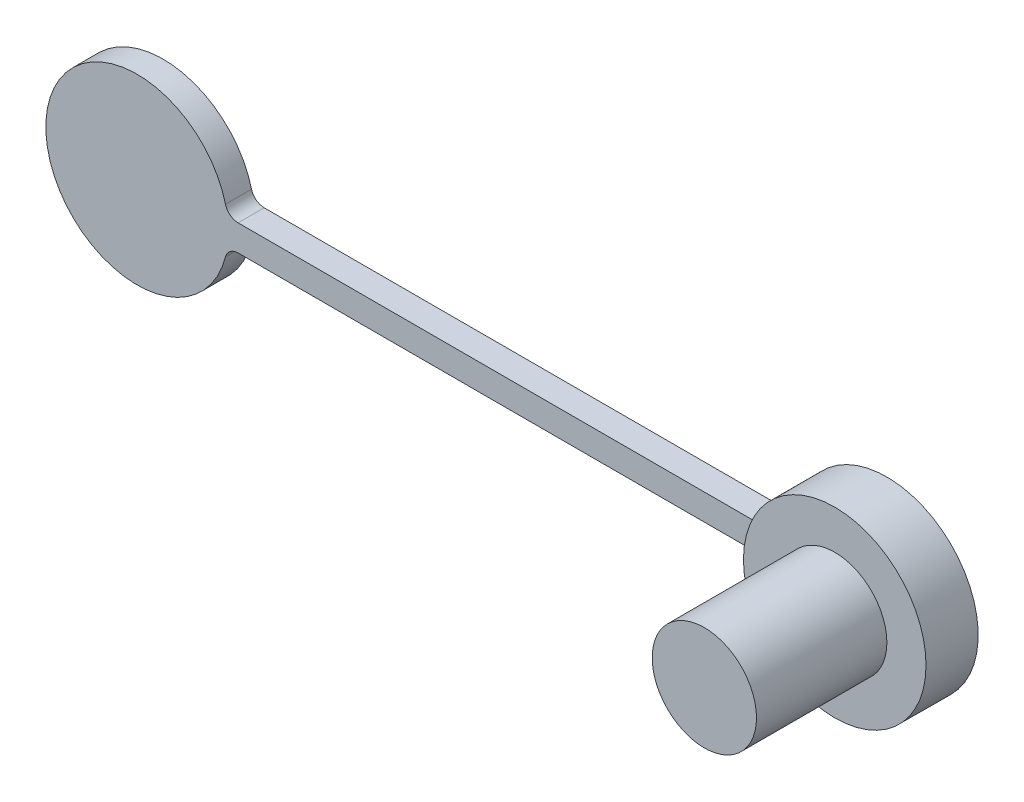
ISO-10303-21;
HEADER;
FILE_DESCRIPTION(('STEP AP214'),'2;1');
FILE_NAME('part.step','',(''),(''),'','','');
FILE_SCHEMA(('AUTOMOTIVE_DESIGN { 1 0 10303 214 1 1 1 1 }'));
ENDSEC;
DATA;
#1=APPLICATION_CONTEXT('core data for automotive mechanical design processes');
#2=APPLICATION_PROTOCOL_DEFINITION('international standard','automotive_design',2000,#1);
#3=PRODUCT_CONTEXT('',#1,'mechanical');
#4=PRODUCT('Part','Part','',(#3));
#5=PRODUCT_RELATED_PRODUCT_CATEGORY('part','',(#4));
#6=PRODUCT_DEFINITION_FORMATION('','',#4);
#7=PRODUCT_DEFINITION_CONTEXT('part definition',#1,'design');
#8=PRODUCT_DEFINITION('design','',#6,#7);
#9=PRODUCT_DEFINITION_SHAPE('','',#8);
#10=(LENGTH_UNIT() NAMED_UNIT(*) SI_UNIT(.MILLI.,.METRE.));
#11=(NAMED_UNIT(*) PLANE_ANGLE_UNIT() SI_UNIT($,.RADIAN.));
#12=(NAMED_UNIT(*) SI_UNIT($,.STERADIAN.) SOLID_ANGLE_UNIT());
#13=UNCERTAINTY_MEASURE_WITH_UNIT(LENGTH_MEASURE(1.E-05),#10,'distance_accuracy_value','');
#14=(GEOMETRIC_REPRESENTATION_CONTEXT(3) GLOBAL_UNCERTAINTY_ASSIGNED_CONTEXT((#13)) GLOBAL_UNIT_ASSIGNED_CONTEXT((#10,
#11,#12)) REPRESENTATION_CONTEXT('',''));
#15=CARTESIAN_POINT('',(0.,0.,0.));
#16=DIRECTION('',(0.,0.,1.));
#17=DIRECTION('',(1.,0.,0.));
#18=AXIS2_PLACEMENT_3D('',#15,#16,#17);
#19=CARTESIAN_POINT('',(277.5,4.99999999999999,10.));
#20=DIRECTION('',(0.,-1.,0.));
#21=DIRECTION('',(0.,0.,-1.));
#22=AXIS2_PLACEMENT_3D('',#19,#20,#21);
#23=PLANE('',#22);
#24=DIRECTION('',(-1.,0.,0.));
#25=VECTOR('',#24,1.);
#26=CARTESIAN_POINT('',(277.5,4.99999999999999,10.));
#27=LINE('',#26,#25);
#28=CARTESIAN_POINT('',(238.770166537926,4.99999999999999,10.));
#29=VERTEX_POINT('',#28);
#30=CARTESIAN_POINT('',(38.7298334620742,4.99999999999999,10.));
#31=VERTEX_POINT('',#30);
#32=EDGE_CURVE('E123',#29,#31,#27,.T.);
#33=ORIENTED_EDGE('',*,*,#32,.F.);
#34=DIRECTION('',(0.,0.,1.));
#35=VECTOR('',#34,1.);
#36=CARTESIAN_POINT('',(238.770166537926,4.99999999999999,0.));
#37=LINE('',#36,#35);
#38=CARTESIAN_POINT('',(238.770166537926,4.99999999999999,0.));
#39=VERTEX_POINT('',#38);
#40=EDGE_CURVE('E69',#29,#39,#37,.F.);
#41=ORIENTED_EDGE('',*,*,#40,.T.);
#42=DIRECTION('',(-1.,0.,0.));
#43=VECTOR('',#42,1.);
#44=CARTESIAN_POINT('',(277.5,4.99999999999999,0.));
#45=LINE('',#44,#43);
#46=CARTESIAN_POINT('',(38.7298334620742,4.99999999999999,0.));
#47=VERTEX_POINT('',#46);
#48=EDGE_CURVE('E191',#39,#47,#45,.T.);
#49=ORIENTED_EDGE('',*,*,#48,.T.);
#50=DIRECTION('',(0.,0.,1.));
#51=VECTOR('',#50,1.);
#52=CARTESIAN_POINT('',(38.7298334620742,4.99999999999999,10.));
#53=LINE('',#52,#51);
#54=EDGE_CURVE('E135',#47,#31,#53,.T.);
#55=ORIENTED_EDGE('',*,*,#54,.T.);
#56=EDGE_LOOP('',(#33,#41,#49,#55));
#57=FACE_BOUND('',#56,.T.);
#58=ADVANCED_FACE('F45',(#57),#23,.F.);
#59=CARTESIAN_POINT('',(277.5,-5.00000000000001,10.));
#60=DIRECTION('',(0.,1.,0.));
#61=DIRECTION('',(0.,0.,1.));
#62=AXIS2_PLACEMENT_3D('',#59,#60,#61);
#63=PLANE('',#62);
#64=DIRECTION('',(-1.,0.,0.));
#65=VECTOR('',#64,1.);
#66=CARTESIAN_POINT('',(277.5,-5.00000000000001,0.));
#67=LINE('',#66,#65);
#68=CARTESIAN_POINT('',(238.770166537926,-5.00000000000001,0.));
#69=VERTEX_POINT('',#68);
#70=CARTESIAN_POINT('',(38.7298334620742,-5.00000000000001,0.));
#71=VERTEX_POINT('',#70);
#72=EDGE_CURVE('E124',#69,#71,#67,.T.);
#73=ORIENTED_EDGE('',*,*,#72,.F.);
#74=DIRECTION('',(0.,0.,1.));
#75=VECTOR('',#74,1.);
#76=CARTESIAN_POINT('',(238.770166537926,-5.00000000000001,10.));
#77=LINE('',#76,#75);
#78=CARTESIAN_POINT('',(238.770166537926,-5.00000000000001,10.));
#79=VERTEX_POINT('',#78);
#80=EDGE_CURVE('E119',#69,#79,#77,.T.);
#81=ORIENTED_EDGE('',*,*,#80,.T.);
#82=DIRECTION('',(-1.,0.,0.));
#83=VECTOR('',#82,1.);
#84=CARTESIAN_POINT('',(277.5,-5.00000000000001,10.));
#85=LINE('',#84,#83);
#86=CARTESIAN_POINT('',(38.7298334620742,-5.00000000000001,10.));
#87=VERTEX_POINT('',#86);
#88=EDGE_CURVE('E112',#79,#87,#85,.T.);
#89=ORIENTED_EDGE('',*,*,#88,.T.);
#90=DIRECTION('',(0.,0.,1.));
#91=VECTOR('',#90,1.);
#92=CARTESIAN_POINT('',(38.7298334620742,-5.00000000000001,0.));
#93=LINE('',#92,#91);
#94=EDGE_CURVE('E117',#87,#71,#93,.F.);
#95=ORIENTED_EDGE('',*,*,#94,.T.);
#96=EDGE_LOOP('',(#73,#81,#89,#95));
#97=FACE_BOUND('',#96,.T.);
#98=ADVANCED_FACE('F115',(#97),#63,.F.);
#99=CARTESIAN_POINT('',(0.,0.,10.));
#100=DIRECTION('',(0.,0.,-1.));
#101=DIRECTION('',(-1.,0.,0.));
#102=AXIS2_PLACEMENT_3D('',#99,#100,#101);
#103=CYLINDRICAL_SURFACE('',#102,35.);
#104=CARTESIAN_POINT('',(0.,0.,10.));
#105=DIRECTION('',(0.,0.,1.));
#106=DIRECTION('',(1.,0.,0.));
#107=AXIS2_PLACEMENT_3D('',#104,#105,#106);
#108=CIRCLE('',#107,35.);
#109=CARTESIAN_POINT('',(33.8886042793149,8.74999999999999,10.));
#110=VERTEX_POINT('',#109);
#111=CARTESIAN_POINT('',(33.8886042793149,-8.75000000000001,10.));
#112=VERTEX_POINT('',#111);
#113=EDGE_CURVE('E130',#110,#112,#108,.T.);
#114=ORIENTED_EDGE('',*,*,#113,.F.);
#115=DIRECTION('',(0.,0.,-1.));
#116=VECTOR('',#115,1.);
#117=CARTESIAN_POINT('',(33.8886042793149,8.75,10.));
#118=LINE('',#117,#116);
#119=CARTESIAN_POINT('',(33.8886042793149,8.74999999999999,0.));
#120=VERTEX_POINT('',#119);
#121=EDGE_CURVE('E156',#110,#120,#118,.T.);
#122=ORIENTED_EDGE('',*,*,#121,.T.);
#123=CARTESIAN_POINT('',(0.,0.,0.));
#124=DIRECTION('',(0.,0.,1.));
#125=DIRECTION('',(1.,0.,0.));
#126=AXIS2_PLACEMENT_3D('',#123,#124,#125);
#127=CIRCLE('',#126,35.);
#128=CARTESIAN_POINT('',(33.8886042793149,-8.75000000000001,0.));
#129=VERTEX_POINT('',#128);
#130=EDGE_CURVE('E147',#120,#129,#127,.T.);
#131=ORIENTED_EDGE('',*,*,#130,.T.);
#132=DIRECTION('',(0.,0.,-1.));
#133=VECTOR('',#132,1.);
#134=CARTESIAN_POINT('',(33.8886042793149,-8.75000000000001,10.));
#135=LINE('',#134,#133);
#136=EDGE_CURVE('E142',#129,#112,#135,.F.);
#137=ORIENTED_EDGE('',*,*,#136,.T.);
#138=EDGE_LOOP('',(#114,#122,#131,#137));
#139=FACE_BOUND('',#138,.T.);
#140=ADVANCED_FACE('F221',(#139),#103,.T.);
#141=CARTESIAN_POINT('',(0.,0.,10.));
#142=DIRECTION('',(0.,0.,1.));
#143=DIRECTION('',(1.,0.,0.));
#144=AXIS2_PLACEMENT_3D('',#141,#142,#143);
#145=PLANE('',#144);
#146=ORIENTED_EDGE('',*,*,#88,.F.);
#147=CARTESIAN_POINT('',(238.770166537926,-10.,10.));
#148=DIRECTION('',(0.,0.,1.));
#149=DIRECTION('',(1.,0.,0.));
#150=AXIS2_PLACEMENT_3D('',#147,#148,#149);
#151=CIRCLE('',#150,5.);
#152=CARTESIAN_POINT('',(243.611395720685,-8.75000000000001,10.));
#153=VERTEX_POINT('',#152);
#154=EDGE_CURVE('E175',#79,#153,#151,.F.);
#155=ORIENTED_EDGE('',*,*,#154,.T.);
#156=CARTESIAN_POINT('',(277.5,0.,10.));
#157=DIRECTION('',(0.,0.,1.));
#158=DIRECTION('',(1.,0.,0.));
#159=AXIS2_PLACEMENT_3D('',#156,#157,#158);
#160=CIRCLE('',#159,35.);
#161=CARTESIAN_POINT('',(243.611395720685,8.74999999999999,10.));
#162=VERTEX_POINT('',#161);
#163=EDGE_CURVE('E252',#153,#162,#160,.F.);
#164=ORIENTED_EDGE('',*,*,#163,.T.);
#165=CARTESIAN_POINT('',(238.770166537926,9.99999999999999,10.));
#166=DIRECTION('',(0.,0.,1.));
#167=DIRECTION('',(1.,0.,0.));
#168=AXIS2_PLACEMENT_3D('',#165,#166,#167);
#169=CIRCLE('',#168,5.);
#170=EDGE_CURVE('E62',#162,#29,#169,.F.);
#171=ORIENTED_EDGE('',*,*,#170,.T.);
#172=ORIENTED_EDGE('',*,*,#32,.T.);
#173=CARTESIAN_POINT('',(38.7298334620742,9.99999999999999,10.));
#174=DIRECTION('',(0.,0.,1.));
#175=DIRECTION('',(1.,0.,0.));
#176=AXIS2_PLACEMENT_3D('',#173,#174,#175);
#177=CIRCLE('',#176,5.);
#178=EDGE_CURVE('E159',#31,#110,#177,.F.);
#179=ORIENTED_EDGE('',*,*,#178,.T.);
#180=ORIENTED_EDGE('',*,*,#113,.T.);
#181=CARTESIAN_POINT('',(38.7298334620742,-10.,10.));
#182=DIRECTION('',(0.,0.,1.));
#183=DIRECTION('',(1.,0.,0.));
#184=AXIS2_PLACEMENT_3D('',#181,#182,#183);
#185=CIRCLE('',#184,5.);
#186=EDGE_CURVE('E127',#112,#87,#185,.F.);
#187=ORIENTED_EDGE('',*,*,#186,.T.);
#188=EDGE_LOOP('',(#146,#155,#164,#171,#172,#179,#180,#187));
#189=FACE_BOUND('',#188,.T.);
#190=ADVANCED_FACE('F128',(#189),#145,.T.);
#191=CARTESIAN_POINT('',(0.,0.,0.));
#192=DIRECTION('',(0.,0.,1.));
#193=DIRECTION('',(1.,0.,0.));
#194=AXIS2_PLACEMENT_3D('',#191,#192,#193);
#195=PLANE('',#194);
#196=ORIENTED_EDGE('',*,*,#48,.F.);
#197=CARTESIAN_POINT('',(238.770166537926,9.99999999999999,0.));
#198=DIRECTION('',(0.,0.,1.));
#199=DIRECTION('',(1.,0.,0.));
#200=AXIS2_PLACEMENT_3D('',#197,#198,#199);
#201=CIRCLE('',#200,5.);
#202=CARTESIAN_POINT('',(243.611395720685,8.74999999999999,0.));
#203=VERTEX_POINT('',#202);
#204=EDGE_CURVE('E49',#39,#203,#201,.T.);
#205=ORIENTED_EDGE('',*,*,#204,.T.);
#206=CARTESIAN_POINT('',(277.5,0.,0.));
#207=DIRECTION('',(0.,0.,1.));
#208=DIRECTION('',(1.,0.,0.));
#209=AXIS2_PLACEMENT_3D('',#206,#207,#208);
#210=CIRCLE('',#209,35.);
#211=CARTESIAN_POINT('',(243.611395720685,-8.75000000000001,0.));
#212=VERTEX_POINT('',#211);
#213=EDGE_CURVE('E190',#212,#203,#210,.T.);
#214=ORIENTED_EDGE('',*,*,#213,.F.);
#215=CARTESIAN_POINT('',(238.770166537926,-10.,0.));
#216=DIRECTION('',(0.,0.,1.));
#217=DIRECTION('',(1.,0.,0.));
#218=AXIS2_PLACEMENT_3D('',#215,#216,#217);
#219=CIRCLE('',#218,5.);
#220=EDGE_CURVE('E172',#212,#69,#219,.T.);
#221=ORIENTED_EDGE('',*,*,#220,.T.);
#222=ORIENTED_EDGE('',*,*,#72,.T.);
#223=CARTESIAN_POINT('',(38.7298334620742,-10.,0.));
#224=DIRECTION('',(0.,0.,1.));
#225=DIRECTION('',(1.,0.,0.));
#226=AXIS2_PLACEMENT_3D('',#223,#224,#225);
#227=CIRCLE('',#226,5.);
#228=EDGE_CURVE('E136',#71,#129,#227,.T.);
#229=ORIENTED_EDGE('',*,*,#228,.T.);
#230=ORIENTED_EDGE('',*,*,#130,.F.);
#231=CARTESIAN_POINT('',(38.7298334620742,9.99999999999999,0.));
#232=DIRECTION('',(0.,0.,1.));
#233=DIRECTION('',(1.,0.,0.));
#234=AXIS2_PLACEMENT_3D('',#231,#232,#233);
#235=CIRCLE('',#234,5.);
#236=EDGE_CURVE('E162',#120,#47,#235,.T.);
#237=ORIENTED_EDGE('',*,*,#236,.T.);
#238=EDGE_LOOP('',(#196,#205,#214,#221,#222,#229,#230,#237));
#239=FACE_BOUND('',#238,.T.);
#240=ADVANCED_FACE('F189',(#239),#195,.F.);
#241=CARTESIAN_POINT('',(38.7298334620742,-10.,10.));
#242=DIRECTION('',(0.,0.,-1.));
#243=DIRECTION('',(-1.,0.,0.));
#244=AXIS2_PLACEMENT_3D('',#241,#242,#243);
#245=CYLINDRICAL_SURFACE('',#244,5.);
#246=ORIENTED_EDGE('',*,*,#186,.F.);
#247=ORIENTED_EDGE('',*,*,#136,.F.);
#248=ORIENTED_EDGE('',*,*,#228,.F.);
#249=ORIENTED_EDGE('',*,*,#94,.F.);
#250=EDGE_LOOP('',(#246,#247,#248,#249));
#251=FACE_BOUND('',#250,.T.);
#252=ADVANCED_FACE('F139',(#251),#245,.F.);
#253=CARTESIAN_POINT('',(38.7298334620742,9.99999999999999,10.));
#254=DIRECTION('',(0.,0.,-1.));
#255=DIRECTION('',(-1.,0.,0.));
#256=AXIS2_PLACEMENT_3D('',#253,#254,#255);
#257=CYLINDRICAL_SURFACE('',#256,5.);
#258=ORIENTED_EDGE('',*,*,#236,.F.);
#259=ORIENTED_EDGE('',*,*,#121,.F.);
#260=ORIENTED_EDGE('',*,*,#178,.F.);
#261=ORIENTED_EDGE('',*,*,#54,.F.);
#262=EDGE_LOOP('',(#258,#259,#260,#261));
#263=FACE_BOUND('',#262,.T.);
#264=ADVANCED_FACE('F233',(#263),#257,.F.);
#265=CARTESIAN_POINT('',(277.5,0.,20.));
#266=DIRECTION('',(0.,0.,-1.));
#267=DIRECTION('',(-1.,0.,0.));
#268=AXIS2_PLACEMENT_3D('',#265,#266,#267);
#269=CYLINDRICAL_SURFACE('',#268,35.);
#270=CARTESIAN_POINT('',(277.5,0.,20.));
#271=DIRECTION('',(0.,0.,1.));
#272=DIRECTION('',(1.,0.,0.));
#273=AXIS2_PLACEMENT_3D('',#270,#271,#272);
#274=CIRCLE('',#273,35.);
#275=CARTESIAN_POINT('',(312.5,0.,20.));
#276=VERTEX_POINT('',#275);
#277=EDGE_CURVE('E198',#276,#276,#274,.T.);
#278=ORIENTED_EDGE('',*,*,#277,.F.);
#279=EDGE_LOOP('',(#278));
#280=FACE_BOUND('',#279,.T.);
#281=ORIENTED_EDGE('',*,*,#213,.T.);
#282=DIRECTION('',(0.,0.,-1.));
#283=VECTOR('',#282,1.);
#284=CARTESIAN_POINT('',(243.611395720685,8.75,20.));
#285=LINE('',#284,#283);
#286=EDGE_CURVE('E178',#203,#162,#285,.F.);
#287=ORIENTED_EDGE('',*,*,#286,.T.);
#288=ORIENTED_EDGE('',*,*,#163,.F.);
#289=DIRECTION('',(0.,0.,-1.));
#290=VECTOR('',#289,1.);
#291=CARTESIAN_POINT('',(243.611395720685,-8.75000000000001,20.));
#292=LINE('',#291,#290);
#293=EDGE_CURVE('E166',#153,#212,#292,.T.);
#294=ORIENTED_EDGE('',*,*,#293,.T.);
#295=EDGE_LOOP('',(#281,#287,#288,#294));
#296=FACE_BOUND('',#295,.T.);
#297=ADVANCED_FACE('F195',(#280,#296),#269,.T.);
#298=CARTESIAN_POINT('',(277.5,0.,20.));
#299=DIRECTION('',(0.,0.,1.));
#300=DIRECTION('',(1.,0.,0.));
#301=AXIS2_PLACEMENT_3D('',#298,#299,#300);
#302=PLANE('',#301);
#303=CARTESIAN_POINT('',(277.5,0.,20.));
#304=DIRECTION('',(0.,0.,1.));
#305=DIRECTION('',(1.,0.,0.));
#306=AXIS2_PLACEMENT_3D('',#303,#304,#305);
#307=CIRCLE('',#306,20.);
#308=CARTESIAN_POINT('',(297.5,0.,20.));
#309=VERTEX_POINT('',#308);
#310=EDGE_CURVE('E11',#309,#309,#307,.T.);
#311=ORIENTED_EDGE('',*,*,#310,.F.);
#312=EDGE_LOOP('',(#311));
#313=FACE_BOUND('',#312,.T.);
#314=ORIENTED_EDGE('',*,*,#277,.T.);
#315=EDGE_LOOP('',(#314));
#316=FACE_BOUND('',#315,.T.);
#317=ADVANCED_FACE('F213',(#313,#316),#302,.T.);
#318=CARTESIAN_POINT('',(238.770166537926,-10.,20.));
#319=DIRECTION('',(0.,0.,-1.));
#320=DIRECTION('',(-1.,0.,0.));
#321=AXIS2_PLACEMENT_3D('',#318,#319,#320);
#322=CYLINDRICAL_SURFACE('',#321,5.);
#323=ORIENTED_EDGE('',*,*,#154,.F.);
#324=ORIENTED_EDGE('',*,*,#80,.F.);
#325=ORIENTED_EDGE('',*,*,#220,.F.);
#326=ORIENTED_EDGE('',*,*,#293,.F.);
#327=EDGE_LOOP('',(#323,#324,#325,#326));
#328=FACE_BOUND('',#327,.T.);
#329=ADVANCED_FACE('F203',(#328),#322,.F.);
#330=CARTESIAN_POINT('',(238.770166537926,9.99999999999999,20.));
#331=DIRECTION('',(0.,0.,-1.));
#332=DIRECTION('',(-1.,0.,0.));
#333=AXIS2_PLACEMENT_3D('',#330,#331,#332);
#334=CYLINDRICAL_SURFACE('',#333,5.);
#335=ORIENTED_EDGE('',*,*,#204,.F.);
#336=ORIENTED_EDGE('',*,*,#40,.F.);
#337=ORIENTED_EDGE('',*,*,#170,.F.);
#338=ORIENTED_EDGE('',*,*,#286,.F.);
#339=EDGE_LOOP('',(#335,#336,#337,#338));
#340=FACE_BOUND('',#339,.T.);
#341=ADVANCED_FACE('F47',(#340),#334,.F.);
#342=CARTESIAN_POINT('',(277.5,0.,70.));
#343=DIRECTION('',(0.,0.,-1.));
#344=DIRECTION('',(-1.,0.,0.));
#345=AXIS2_PLACEMENT_3D('',#342,#343,#344);
#346=CYLINDRICAL_SURFACE('',#345,20.);
#347=CARTESIAN_POINT('',(277.5,0.,70.));
#348=DIRECTION('',(0.,0.,1.));
#349=DIRECTION('',(1.,0.,0.));
#350=AXIS2_PLACEMENT_3D('',#347,#348,#349);
#351=CIRCLE('',#350,20.);
#352=CARTESIAN_POINT('',(297.5,0.,70.));
#353=VERTEX_POINT('',#352);
#354=EDGE_CURVE('E199',#353,#353,#351,.T.);
#355=ORIENTED_EDGE('',*,*,#354,.F.);
#356=EDGE_LOOP('',(#355));
#357=FACE_BOUND('',#356,.T.);
#358=ORIENTED_EDGE('',*,*,#310,.T.);
#359=EDGE_LOOP('',(#358));
#360=FACE_BOUND('',#359,.T.);
#361=ADVANCED_FACE('F202',(#357,#360),#346,.T.);
#362=CARTESIAN_POINT('',(277.5,0.,70.));
#363=DIRECTION('',(0.,0.,1.));
#364=DIRECTION('',(1.,0.,0.));
#365=AXIS2_PLACEMENT_3D('',#362,#363,#364);
#366=PLANE('',#365);
#367=ORIENTED_EDGE('',*,*,#354,.T.);
#368=EDGE_LOOP('',(#367));
#369=FACE_BOUND('',#368,.T.);
#370=ADVANCED_FACE('F209',(#369),#366,.T.);
#371=CLOSED_SHELL('',(#58,#98,#140,#190,#240,#252,#264,#297,#317,#329,#341,#361,#370));
#372=MANIFOLD_SOLID_BREP('B2',#371);
#373=ADVANCED_BREP_SHAPE_REPRESENTATION('',(#18,#372),#14);
#374=SHAPE_DEFINITION_REPRESENTATION(#9,#373);
ENDSEC;
END-ISO-10303-21;
